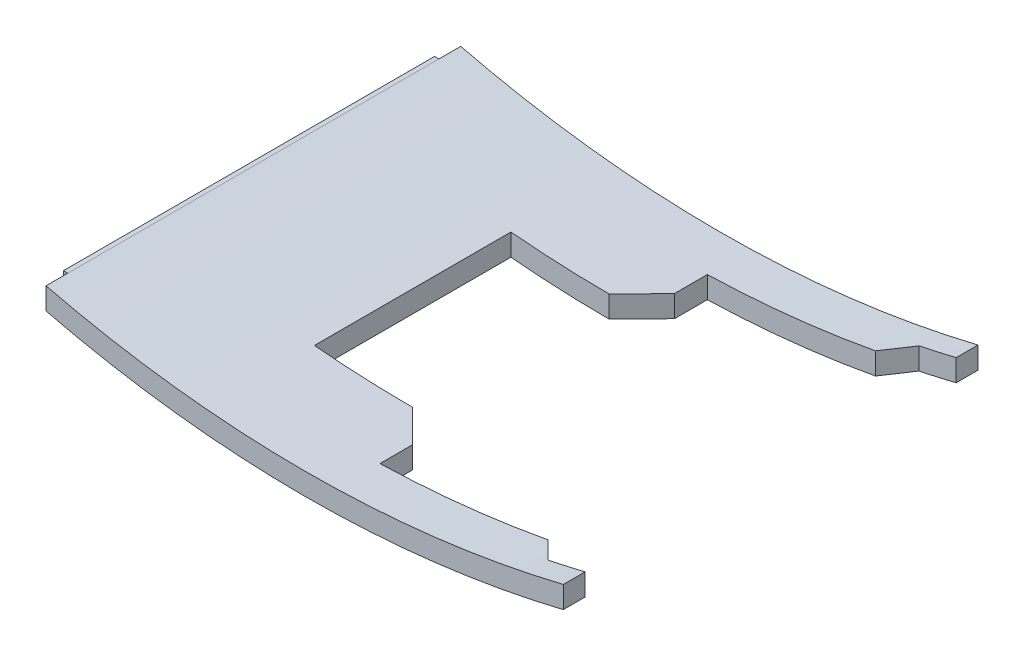
ISO-10303-21;
HEADER;
FILE_DESCRIPTION(('STEP AP214'),'2;1');
FILE_NAME('part.step','',(''),(''),'','','');
FILE_SCHEMA(('AUTOMOTIVE_DESIGN { 1 0 10303 214 1 1 1 1 }'));
ENDSEC;
DATA;
#1=APPLICATION_CONTEXT('core data for automotive mechanical design processes');
#2=APPLICATION_PROTOCOL_DEFINITION('international standard','automotive_design',2000,#1);
#3=PRODUCT_CONTEXT('',#1,'mechanical');
#4=PRODUCT('Part','Part','',(#3));
#5=PRODUCT_RELATED_PRODUCT_CATEGORY('part','',(#4));
#6=PRODUCT_DEFINITION_FORMATION('','',#4);
#7=PRODUCT_DEFINITION_CONTEXT('part definition',#1,'design');
#8=PRODUCT_DEFINITION('design','',#6,#7);
#9=PRODUCT_DEFINITION_SHAPE('','',#8);
#10=(LENGTH_UNIT() NAMED_UNIT(*) SI_UNIT(.MILLI.,.METRE.));
#11=(NAMED_UNIT(*) PLANE_ANGLE_UNIT() SI_UNIT($,.RADIAN.));
#12=(NAMED_UNIT(*) SI_UNIT($,.STERADIAN.) SOLID_ANGLE_UNIT());
#13=UNCERTAINTY_MEASURE_WITH_UNIT(LENGTH_MEASURE(1.E-05),#10,'distance_accuracy_value','');
#14=(GEOMETRIC_REPRESENTATION_CONTEXT(3) GLOBAL_UNCERTAINTY_ASSIGNED_CONTEXT((#13)) GLOBAL_UNIT_ASSIGNED_CONTEXT((#10,
#11,#12)) REPRESENTATION_CONTEXT('',''));
#15=CARTESIAN_POINT('',(0.,0.,0.));
#16=DIRECTION('',(0.,0.,1.));
#17=DIRECTION('',(1.,0.,0.));
#18=AXIS2_PLACEMENT_3D('',#15,#16,#17);
#19=CARTESIAN_POINT('',(0.,0.,48.26));
#20=DIRECTION('',(1.,0.,0.));
#21=DIRECTION('',(0.,0.,-1.));
#22=AXIS2_PLACEMENT_3D('',#19,#20,#21);
#23=PLANE('',#22);
#24=DIRECTION('',(0.,-1.,0.));
#25=VECTOR('',#24,1.);
#26=CARTESIAN_POINT('',(0.,2.54,2.54));
#27=LINE('',#26,#25);
#28=CARTESIAN_POINT('',(0.,2.54,2.54000000000001));
#29=VERTEX_POINT('',#28);
#30=CARTESIAN_POINT('',(0.,0.,2.54000000000001));
#31=VERTEX_POINT('',#30);
#32=EDGE_CURVE('E214',#29,#31,#27,.T.);
#33=ORIENTED_EDGE('',*,*,#32,.F.);
#34=DIRECTION('',(0.,0.,-1.));
#35=VECTOR('',#34,1.);
#36=CARTESIAN_POINT('',(0.,2.54,48.26));
#37=LINE('',#36,#35);
#38=CARTESIAN_POINT('',(0.,2.54,0.));
#39=VERTEX_POINT('',#38);
#40=EDGE_CURVE('E289',#29,#39,#37,.T.);
#41=ORIENTED_EDGE('',*,*,#40,.T.);
#42=DIRECTION('',(0.,-1.,0.));
#43=VECTOR('',#42,1.);
#44=CARTESIAN_POINT('',(0.,0.,0.));
#45=LINE('',#44,#43);
#46=CARTESIAN_POINT('',(0.,0.,0.));
#47=VERTEX_POINT('',#46);
#48=EDGE_CURVE('E269',#39,#47,#45,.T.);
#49=ORIENTED_EDGE('',*,*,#48,.T.);
#50=DIRECTION('',(0.,0.,-1.));
#51=VECTOR('',#50,1.);
#52=CARTESIAN_POINT('',(0.,0.,48.26));
#53=LINE('',#52,#51);
#54=EDGE_CURVE('E275',#31,#47,#53,.T.);
#55=ORIENTED_EDGE('',*,*,#54,.F.);
#56=EDGE_LOOP('',(#33,#41,#49,#55));
#57=FACE_BOUND('',#56,.T.);
#58=ADVANCED_FACE('F41',(#57),#23,.F.);
#59=DIRECTION('',(0.,1.,0.));
#60=VECTOR('',#59,1.);
#61=CARTESIAN_POINT('',(0.,2.54,45.72));
#62=LINE('',#61,#60);
#63=CARTESIAN_POINT('',(0.,0.,45.72));
#64=VERTEX_POINT('',#63);
#65=CARTESIAN_POINT('',(0.,2.54,45.72));
#66=VERTEX_POINT('',#65);
#67=EDGE_CURVE('E396',#64,#66,#62,.T.);
#68=ORIENTED_EDGE('',*,*,#67,.F.);
#69=CARTESIAN_POINT('',(0.,0.,48.26));
#70=VERTEX_POINT('',#69);
#71=EDGE_CURVE('E286',#70,#64,#53,.T.);
#72=ORIENTED_EDGE('',*,*,#71,.F.);
#73=DIRECTION('',(0.,-1.,0.));
#74=VECTOR('',#73,1.);
#75=CARTESIAN_POINT('',(0.,0.,48.26));
#76=LINE('',#75,#74);
#77=CARTESIAN_POINT('',(0.,2.54,48.26));
#78=VERTEX_POINT('',#77);
#79=EDGE_CURVE('E273',#78,#70,#76,.T.);
#80=ORIENTED_EDGE('',*,*,#79,.F.);
#81=EDGE_CURVE('E290',#78,#66,#37,.T.);
#82=ORIENTED_EDGE('',*,*,#81,.T.);
#83=EDGE_LOOP('',(#68,#72,#80,#82));
#84=FACE_BOUND('',#83,.T.);
#85=ADVANCED_FACE('F456',(#84),#23,.F.);
#86=CARTESIAN_POINT('',(60.198,0.,48.26));
#87=DIRECTION('',(-1.,0.,0.));
#88=DIRECTION('',(0.,0.,1.));
#89=AXIS2_PLACEMENT_3D('',#86,#87,#88);
#90=PLANE('',#89);
#91=DIRECTION('',(0.,0.,-1.));
#92=VECTOR('',#91,1.);
#93=CARTESIAN_POINT('',(60.198,0.,48.26));
#94=LINE('',#93,#92);
#95=CARTESIAN_POINT('',(60.198,0.,48.26));
#96=VERTEX_POINT('',#95);
#97=CARTESIAN_POINT('',(60.198,0.,45.72));
#98=VERTEX_POINT('',#97);
#99=EDGE_CURVE('E297',#96,#98,#94,.T.);
#100=ORIENTED_EDGE('',*,*,#99,.T.);
#101=DIRECTION('',(0.,1.,0.));
#102=VECTOR('',#101,1.);
#103=CARTESIAN_POINT('',(60.198,-21.59,45.72));
#104=LINE('',#103,#102);
#105=CARTESIAN_POINT('',(60.198,2.54000000000001,45.72));
#106=VERTEX_POINT('',#105);
#107=EDGE_CURVE('E215',#98,#106,#104,.T.);
#108=ORIENTED_EDGE('',*,*,#107,.T.);
#109=DIRECTION('',(0.,0.,-1.));
#110=VECTOR('',#109,1.);
#111=CARTESIAN_POINT('',(60.198,2.54,48.26));
#112=LINE('',#111,#110);
#113=CARTESIAN_POINT('',(60.198,2.54,48.26));
#114=VERTEX_POINT('',#113);
#115=EDGE_CURVE('E293',#114,#106,#112,.T.);
#116=ORIENTED_EDGE('',*,*,#115,.F.);
#117=DIRECTION('',(0.,1.,0.));
#118=VECTOR('',#117,1.);
#119=CARTESIAN_POINT('',(60.198,0.,48.26));
#120=LINE('',#119,#118);
#121=EDGE_CURVE('E268',#96,#114,#120,.T.);
#122=ORIENTED_EDGE('',*,*,#121,.F.);
#123=EDGE_LOOP('',(#100,#108,#116,#122));
#124=FACE_BOUND('',#123,.T.);
#125=ADVANCED_FACE('F386',(#124),#90,.F.);
#126=CARTESIAN_POINT('',(30.099,123.381725547181,48.26));
#127=DIRECTION('',(0.,0.,-1.));
#128=DIRECTION('',(-1.,0.,0.));
#129=AXIS2_PLACEMENT_3D('',#126,#127,#128);
#130=CYLINDRICAL_SURFACE('',#129,127.);
#131=DIRECTION('',(0.,0.,-1.));
#132=VECTOR('',#131,1.);
#133=CARTESIAN_POINT('',(33.782,-3.56485972000879,48.26));
#134=LINE('',#133,#132);
#135=CARTESIAN_POINT('',(33.782,-3.56485972000882,5.08));
#136=VERTEX_POINT('',#135);
#137=CARTESIAN_POINT('',(33.782,-3.56485972000879,8.89000000000001));
#138=VERTEX_POINT('',#137);
#139=EDGE_CURVE('E233',#136,#138,#134,.F.);
#140=ORIENTED_EDGE('',*,*,#139,.T.);
#141=CARTESIAN_POINT('',(30.099,123.381725547181,12.573));
#142=DIRECTION('',(-0.707106781186549,0.,-0.707106781186546));
#143=DIRECTION('',(0.707106781186546,0.,-0.707106781186549));
#144=AXIS2_PLACEMENT_3D('',#141,#142,#143);
#145=ELLIPSE('',#144,179.605122421383,127.);
#146=CARTESIAN_POINT('',(29.972,-3.61821095280269,12.7));
#147=VERTEX_POINT('',#146);
#148=EDGE_CURVE('E350',#138,#147,#145,.T.);
#149=ORIENTED_EDGE('',*,*,#148,.T.);
#150=CARTESIAN_POINT('',(30.099,123.381725547181,12.7));
#151=DIRECTION('',(0.,0.,-1.));
#152=DIRECTION('',(-1.,0.,0.));
#153=AXIS2_PLACEMENT_3D('',#150,#151,#152);
#154=CIRCLE('',#153,127.);
#155=CARTESIAN_POINT('',(18.542,-3.09133779438552,12.7));
#156=VERTEX_POINT('',#155);
#157=EDGE_CURVE('E255',#147,#156,#154,.T.);
#158=ORIENTED_EDGE('',*,*,#157,.T.);
#159=DIRECTION('',(0.,0.,-1.));
#160=VECTOR('',#159,1.);
#161=CARTESIAN_POINT('',(18.542,-3.09133779438549,48.26));
#162=LINE('',#161,#160);
#163=CARTESIAN_POINT('',(18.542,-3.09133779438549,35.56));
#164=VERTEX_POINT('',#163);
#165=EDGE_CURVE('E259',#156,#164,#162,.F.);
#166=ORIENTED_EDGE('',*,*,#165,.T.);
#167=CARTESIAN_POINT('',(30.099,123.381725547181,35.56));
#168=DIRECTION('',(0.,0.,1.));
#169=DIRECTION('',(1.,0.,0.));
#170=AXIS2_PLACEMENT_3D('',#167,#168,#169);
#171=CIRCLE('',#170,127.);
#172=CARTESIAN_POINT('',(29.972,-3.61821095280269,35.56));
#173=VERTEX_POINT('',#172);
#174=EDGE_CURVE('E262',#164,#173,#171,.T.);
#175=ORIENTED_EDGE('',*,*,#174,.T.);
#176=CARTESIAN_POINT('',(30.099,123.381725547181,35.687));
#177=DIRECTION('',(-0.707106781186547,0.,0.707106781186548));
#178=DIRECTION('',(-0.707106781186548,0.,-0.707106781186547));
#179=AXIS2_PLACEMENT_3D('',#176,#177,#178);
#180=ELLIPSE('',#179,179.605122421383,127.);
#181=CARTESIAN_POINT('',(33.782,-3.56485972000879,39.37));
#182=VERTEX_POINT('',#181);
#183=EDGE_CURVE('E57',#173,#182,#180,.T.);
#184=ORIENTED_EDGE('',*,*,#183,.T.);
#185=DIRECTION('',(0.,0.,-1.));
#186=VECTOR('',#185,1.);
#187=CARTESIAN_POINT('',(33.782,-3.56485972000879,48.26));
#188=LINE('',#187,#186);
#189=CARTESIAN_POINT('',(33.782,-3.56485972000882,43.18));
#190=VERTEX_POINT('',#189);
#191=EDGE_CURVE('E239',#182,#190,#188,.F.);
#192=ORIENTED_EDGE('',*,*,#191,.T.);
#193=CARTESIAN_POINT('',(30.099,123.381725547181,43.18));
#194=DIRECTION('',(0.,0.,1.));
#195=DIRECTION('',(1.,0.,0.));
#196=AXIS2_PLACEMENT_3D('',#193,#194,#195);
#197=CIRCLE('',#196,127.);
#198=CARTESIAN_POINT('',(53.34,-1.47361442272134,43.18));
#199=VERTEX_POINT('',#198);
#200=EDGE_CURVE('E241',#190,#199,#197,.T.);
#201=ORIENTED_EDGE('',*,*,#200,.T.);
#202=CARTESIAN_POINT('',(30.099,123.381725547181,19.9389999999998));
#203=DIRECTION('',(-0.707106781186551,0.,0.707106781186544));
#204=DIRECTION('',(-0.707106781186544,0.,-0.707106781186551));
#205=AXIS2_PLACEMENT_3D('',#202,#203,#204);
#206=ELLIPSE('',#205,179.605122421384,127.);
#207=CARTESIAN_POINT('',(55.88,-0.973974117128287,45.72));
#208=VERTEX_POINT('',#207);
#209=EDGE_CURVE('E328',#199,#208,#206,.T.);
#210=ORIENTED_EDGE('',*,*,#209,.T.);
#211=CARTESIAN_POINT('',(30.099,123.381725547181,45.72));
#212=DIRECTION('',(0.,0.,1.));
#213=DIRECTION('',(1.,0.,0.));
#214=AXIS2_PLACEMENT_3D('',#211,#212,#213);
#215=CIRCLE('',#214,127.);
#216=EDGE_CURVE('E244',#208,#98,#215,.T.);
#217=ORIENTED_EDGE('',*,*,#216,.T.);
#218=ORIENTED_EDGE('',*,*,#99,.F.);
#219=CARTESIAN_POINT('',(30.099,123.381725547181,48.26));
#220=DIRECTION('',(0.,0.,1.));
#221=DIRECTION('',(1.,0.,0.));
#222=AXIS2_PLACEMENT_3D('',#219,#220,#221);
#223=CIRCLE('',#222,127.);
#224=EDGE_CURVE('E265',#70,#96,#223,.T.);
#225=ORIENTED_EDGE('',*,*,#224,.F.);
#226=ORIENTED_EDGE('',*,*,#71,.T.);
#227=DIRECTION('',(0.,0.,1.));
#228=VECTOR('',#227,1.);
#229=CARTESIAN_POINT('',(0.,0.,2.54));
#230=LINE('',#229,#228);
#231=EDGE_CURVE('E394',#31,#64,#230,.T.);
#232=ORIENTED_EDGE('',*,*,#231,.F.);
#233=ORIENTED_EDGE('',*,*,#54,.T.);
#234=CARTESIAN_POINT('',(30.099,123.381725547181,0.));
#235=DIRECTION('',(0.,0.,1.));
#236=DIRECTION('',(1.,0.,0.));
#237=AXIS2_PLACEMENT_3D('',#234,#235,#236);
#238=CIRCLE('',#237,127.);
#239=CARTESIAN_POINT('',(60.198,0.,0.));
#240=VERTEX_POINT('',#239);
#241=EDGE_CURVE('E264',#47,#240,#238,.T.);
#242=ORIENTED_EDGE('',*,*,#241,.T.);
#243=CARTESIAN_POINT('',(60.198,0.,2.54));
#244=VERTEX_POINT('',#243);
#245=EDGE_CURVE('E296',#244,#240,#94,.T.);
#246=ORIENTED_EDGE('',*,*,#245,.F.);
#247=CARTESIAN_POINT('',(30.099,123.381725547181,2.54));
#248=DIRECTION('',(0.,0.,-1.));
#249=DIRECTION('',(-1.,0.,0.));
#250=AXIS2_PLACEMENT_3D('',#247,#248,#249);
#251=CIRCLE('',#250,127.);
#252=CARTESIAN_POINT('',(55.88,-0.973974117128297,2.54));
#253=VERTEX_POINT('',#252);
#254=EDGE_CURVE('E247',#244,#253,#251,.T.);
#255=ORIENTED_EDGE('',*,*,#254,.T.);
#256=CARTESIAN_POINT('',(30.099,123.381725547181,28.3209999999998));
#257=DIRECTION('',(-0.707106781186544,0.,-0.707106781186551));
#258=DIRECTION('',(0.707106781186551,0.,-0.707106781186544));
#259=AXIS2_PLACEMENT_3D('',#256,#257,#258);
#260=ELLIPSE('',#259,179.605122421382,127.);
#261=CARTESIAN_POINT('',(53.34,-1.47361442272136,5.08));
#262=VERTEX_POINT('',#261);
#263=EDGE_CURVE('E326',#253,#262,#260,.T.);
#264=ORIENTED_EDGE('',*,*,#263,.T.);
#265=CARTESIAN_POINT('',(30.099,123.381725547181,5.08));
#266=DIRECTION('',(0.,0.,-1.));
#267=DIRECTION('',(-1.,0.,0.));
#268=AXIS2_PLACEMENT_3D('',#265,#266,#267);
#269=CIRCLE('',#268,127.);
#270=EDGE_CURVE('E249',#262,#136,#269,.T.);
#271=ORIENTED_EDGE('',*,*,#270,.T.);
#272=EDGE_LOOP('',(#140,#149,#158,#166,#175,#184,#192,#201,#210,#217,#218,#225,#226,#232,#233,
#242,#246,#255,#264,#271));
#273=FACE_BOUND('',#272,.T.);
#274=ADVANCED_FACE('F356',(#273),#130,.T.);
#275=CARTESIAN_POINT('',(60.198,2.54000000000003,2.54));
#276=VERTEX_POINT('',#275);
#277=CARTESIAN_POINT('',(60.198,2.54,0.));
#278=VERTEX_POINT('',#277);
#279=EDGE_CURVE('E292',#276,#278,#112,.T.);
#280=ORIENTED_EDGE('',*,*,#279,.F.);
#281=DIRECTION('',(0.,1.,0.));
#282=VECTOR('',#281,1.);
#283=CARTESIAN_POINT('',(60.198,-21.59,2.54));
#284=LINE('',#283,#282);
#285=EDGE_CURVE('E228',#244,#276,#284,.T.);
#286=ORIENTED_EDGE('',*,*,#285,.F.);
#287=ORIENTED_EDGE('',*,*,#245,.T.);
#288=DIRECTION('',(0.,1.,0.));
#289=VECTOR('',#288,1.);
#290=CARTESIAN_POINT('',(60.198,0.,0.));
#291=LINE('',#290,#289);
#292=EDGE_CURVE('E278',#240,#278,#291,.T.);
#293=ORIENTED_EDGE('',*,*,#292,.T.);
#294=EDGE_LOOP('',(#280,#286,#287,#293));
#295=FACE_BOUND('',#294,.T.);
#296=ADVANCED_FACE('F426',(#295),#90,.F.);
#297=CARTESIAN_POINT('',(30.099,125.921725547181,48.26));
#298=DIRECTION('',(0.,0.,-1.));
#299=DIRECTION('',(-1.,0.,0.));
#300=AXIS2_PLACEMENT_3D('',#297,#298,#299);
#301=CYLINDRICAL_SURFACE('',#300,127.);
#302=CARTESIAN_POINT('',(30.099,125.921725547181,12.7));
#303=DIRECTION('',(0.,0.,-1.));
#304=DIRECTION('',(-1.,0.,0.));
#305=AXIS2_PLACEMENT_3D('',#302,#303,#304);
#306=CIRCLE('',#305,127.);
#307=CARTESIAN_POINT('',(18.542,-0.551337794385515,12.7));
#308=VERTEX_POINT('',#307);
#309=CARTESIAN_POINT('',(29.972,-1.07821095280269,12.7));
#310=VERTEX_POINT('',#309);
#311=EDGE_CURVE('E300',#308,#310,#306,.F.);
#312=ORIENTED_EDGE('',*,*,#311,.T.);
#313=CARTESIAN_POINT('',(30.099,125.921725547181,12.573));
#314=DIRECTION('',(-0.707106781186549,0.,-0.707106781186546));
#315=DIRECTION('',(0.707106781186546,0.,-0.707106781186549));
#316=AXIS2_PLACEMENT_3D('',#313,#314,#315);
#317=ELLIPSE('',#316,179.605122421383,127.);
#318=CARTESIAN_POINT('',(33.782,-1.02485972000879,8.89000000000001));
#319=VERTEX_POINT('',#318);
#320=EDGE_CURVE('E345',#310,#319,#317,.F.);
#321=ORIENTED_EDGE('',*,*,#320,.T.);
#322=DIRECTION('',(0.,0.,-1.));
#323=VECTOR('',#322,1.);
#324=CARTESIAN_POINT('',(33.782,-1.02485972000879,48.26));
#325=LINE('',#324,#323);
#326=CARTESIAN_POINT('',(33.782,-1.02485972000882,5.08));
#327=VERTEX_POINT('',#326);
#328=EDGE_CURVE('E227',#319,#327,#325,.T.);
#329=ORIENTED_EDGE('',*,*,#328,.T.);
#330=CARTESIAN_POINT('',(30.099,125.921725547181,5.08));
#331=DIRECTION('',(0.,0.,-1.));
#332=DIRECTION('',(-1.,0.,0.));
#333=AXIS2_PLACEMENT_3D('',#330,#331,#332);
#334=CIRCLE('',#333,127.);
#335=CARTESIAN_POINT('',(53.34,1.06638557727864,5.08));
#336=VERTEX_POINT('',#335);
#337=EDGE_CURVE('E315',#327,#336,#334,.F.);
#338=ORIENTED_EDGE('',*,*,#337,.T.);
#339=CARTESIAN_POINT('',(30.099,125.921725547181,28.3209999999998));
#340=DIRECTION('',(-0.707106781186544,0.,-0.707106781186551));
#341=DIRECTION('',(0.707106781186551,0.,-0.707106781186544));
#342=AXIS2_PLACEMENT_3D('',#339,#340,#341);
#343=ELLIPSE('',#342,179.605122421382,127.);
#344=CARTESIAN_POINT('',(55.88,1.5660258828717,2.54));
#345=VERTEX_POINT('',#344);
#346=EDGE_CURVE('E318',#336,#345,#343,.F.);
#347=ORIENTED_EDGE('',*,*,#346,.T.);
#348=CARTESIAN_POINT('',(30.099,125.921725547181,2.54));
#349=DIRECTION('',(0.,0.,-1.));
#350=DIRECTION('',(-1.,0.,0.));
#351=AXIS2_PLACEMENT_3D('',#348,#349,#350);
#352=CIRCLE('',#351,127.);
#353=EDGE_CURVE('E312',#345,#276,#352,.F.);
#354=ORIENTED_EDGE('',*,*,#353,.T.);
#355=ORIENTED_EDGE('',*,*,#279,.T.);
#356=CARTESIAN_POINT('',(30.099,125.921725547181,0.));
#357=DIRECTION('',(0.,0.,-1.));
#358=DIRECTION('',(1.,0.,0.));
#359=AXIS2_PLACEMENT_3D('',#356,#357,#358);
#360=CIRCLE('',#359,127.);
#361=EDGE_CURVE('E281',#278,#39,#360,.T.);
#362=ORIENTED_EDGE('',*,*,#361,.T.);
#363=ORIENTED_EDGE('',*,*,#40,.F.);
#364=DIRECTION('',(0.,0.,-1.));
#365=VECTOR('',#364,1.);
#366=CARTESIAN_POINT('',(0.,2.54,2.54));
#367=LINE('',#366,#365);
#368=EDGE_CURVE('E211',#66,#29,#367,.T.);
#369=ORIENTED_EDGE('',*,*,#368,.F.);
#370=ORIENTED_EDGE('',*,*,#81,.F.);
#371=CARTESIAN_POINT('',(30.099,125.921725547181,48.26));
#372=DIRECTION('',(0.,0.,-1.));
#373=DIRECTION('',(1.,0.,0.));
#374=AXIS2_PLACEMENT_3D('',#371,#372,#373);
#375=CIRCLE('',#374,127.);
#376=EDGE_CURVE('E271',#114,#78,#375,.T.);
#377=ORIENTED_EDGE('',*,*,#376,.F.);
#378=ORIENTED_EDGE('',*,*,#115,.T.);
#379=CARTESIAN_POINT('',(30.099,125.921725547181,45.72));
#380=DIRECTION('',(0.,0.,1.));
#381=DIRECTION('',(1.,0.,0.));
#382=AXIS2_PLACEMENT_3D('',#379,#380,#381);
#383=CIRCLE('',#382,127.);
#384=CARTESIAN_POINT('',(55.88,1.56602588287171,45.72));
#385=VERTEX_POINT('',#384);
#386=EDGE_CURVE('E310',#106,#385,#383,.F.);
#387=ORIENTED_EDGE('',*,*,#386,.T.);
#388=CARTESIAN_POINT('',(30.099,125.921725547181,19.9389999999998));
#389=DIRECTION('',(-0.707106781186551,0.,0.707106781186544));
#390=DIRECTION('',(-0.707106781186544,0.,-0.707106781186551));
#391=AXIS2_PLACEMENT_3D('',#388,#389,#390);
#392=ELLIPSE('',#391,179.605122421384,127.);
#393=CARTESIAN_POINT('',(53.34,1.06638557727866,43.18));
#394=VERTEX_POINT('',#393);
#395=EDGE_CURVE('E321',#385,#394,#392,.F.);
#396=ORIENTED_EDGE('',*,*,#395,.T.);
#397=CARTESIAN_POINT('',(30.099,125.921725547181,43.18));
#398=DIRECTION('',(0.,0.,1.));
#399=DIRECTION('',(1.,0.,0.));
#400=AXIS2_PLACEMENT_3D('',#397,#398,#399);
#401=CIRCLE('',#400,127.);
#402=CARTESIAN_POINT('',(33.782,-1.02485972000882,43.18));
#403=VERTEX_POINT('',#402);
#404=EDGE_CURVE('E308',#394,#403,#401,.F.);
#405=ORIENTED_EDGE('',*,*,#404,.T.);
#406=DIRECTION('',(0.,0.,-1.));
#407=VECTOR('',#406,1.);
#408=CARTESIAN_POINT('',(33.782,-1.02485972000879,48.26));
#409=LINE('',#408,#407);
#410=CARTESIAN_POINT('',(33.782,-1.02485972000879,39.37));
#411=VERTEX_POINT('',#410);
#412=EDGE_CURVE('E236',#403,#411,#409,.T.);
#413=ORIENTED_EDGE('',*,*,#412,.T.);
#414=CARTESIAN_POINT('',(30.099,125.921725547181,35.687));
#415=DIRECTION('',(-0.707106781186547,0.,0.707106781186548));
#416=DIRECTION('',(-0.707106781186548,0.,-0.707106781186547));
#417=AXIS2_PLACEMENT_3D('',#414,#415,#416);
#418=ELLIPSE('',#417,179.605122421383,127.);
#419=CARTESIAN_POINT('',(29.972,-1.07821095280269,35.56));
#420=VERTEX_POINT('',#419);
#421=EDGE_CURVE('E343',#411,#420,#418,.F.);
#422=ORIENTED_EDGE('',*,*,#421,.T.);
#423=CARTESIAN_POINT('',(30.099,125.921725547181,35.56));
#424=DIRECTION('',(0.,0.,1.));
#425=DIRECTION('',(1.,0.,0.));
#426=AXIS2_PLACEMENT_3D('',#423,#424,#425);
#427=CIRCLE('',#426,127.);
#428=CARTESIAN_POINT('',(18.542,-0.551337794385487,35.56));
#429=VERTEX_POINT('',#428);
#430=EDGE_CURVE('E306',#420,#429,#427,.F.);
#431=ORIENTED_EDGE('',*,*,#430,.T.);
#432=DIRECTION('',(0.,0.,-1.));
#433=VECTOR('',#432,1.);
#434=CARTESIAN_POINT('',(18.542,-0.551337794385487,48.26));
#435=LINE('',#434,#433);
#436=EDGE_CURVE('E303',#429,#308,#435,.T.);
#437=ORIENTED_EDGE('',*,*,#436,.T.);
#438=EDGE_LOOP('',(#312,#321,#329,#338,#347,#354,#355,#362,#363,#369,#370,#377,#378,#387,#396,
#405,#413,#422,#431,#437));
#439=FACE_BOUND('',#438,.T.);
#440=ADVANCED_FACE('F367',(#439),#301,.F.);
#441=CARTESIAN_POINT('',(30.099,123.381725547181,48.26));
#442=DIRECTION('',(0.,0.,1.));
#443=DIRECTION('',(1.,0.,0.));
#444=AXIS2_PLACEMENT_3D('',#441,#442,#443);
#445=PLANE('',#444);
#446=ORIENTED_EDGE('',*,*,#224,.T.);
#447=ORIENTED_EDGE('',*,*,#121,.T.);
#448=ORIENTED_EDGE('',*,*,#376,.T.);
#449=ORIENTED_EDGE('',*,*,#79,.T.);
#450=EDGE_LOOP('',(#446,#447,#448,#449));
#451=FACE_BOUND('',#450,.T.);
#452=ADVANCED_FACE('F390',(#451),#445,.T.);
#453=CARTESIAN_POINT('',(30.099,123.381725547181,0.));
#454=DIRECTION('',(0.,0.,1.));
#455=DIRECTION('',(1.,0.,0.));
#456=AXIS2_PLACEMENT_3D('',#453,#454,#455);
#457=PLANE('',#456);
#458=ORIENTED_EDGE('',*,*,#241,.F.);
#459=ORIENTED_EDGE('',*,*,#48,.F.);
#460=ORIENTED_EDGE('',*,*,#361,.F.);
#461=ORIENTED_EDGE('',*,*,#292,.F.);
#462=EDGE_LOOP('',(#458,#459,#460,#461));
#463=FACE_BOUND('',#462,.T.);
#464=ADVANCED_FACE('F423',(#463),#457,.F.);
#465=CARTESIAN_POINT('',(60.198,-21.59,35.56));
#466=DIRECTION('',(0.,0.,1.));
#467=DIRECTION('',(1.,0.,0.));
#468=AXIS2_PLACEMENT_3D('',#465,#466,#467);
#469=PLANE('',#468);
#470=ORIENTED_EDGE('',*,*,#430,.F.);
#471=DIRECTION('',(0.,-1.,0.));
#472=VECTOR('',#471,1.);
#473=CARTESIAN_POINT('',(29.972,-21.59,35.56));
#474=LINE('',#473,#472);
#475=EDGE_CURVE('E50',#420,#173,#474,.T.);
#476=ORIENTED_EDGE('',*,*,#475,.T.);
#477=ORIENTED_EDGE('',*,*,#174,.F.);
#478=DIRECTION('',(0.,1.,0.));
#479=VECTOR('',#478,1.);
#480=CARTESIAN_POINT('',(18.542,-21.59,35.56));
#481=LINE('',#480,#479);
#482=EDGE_CURVE('E252',#164,#429,#481,.T.);
#483=ORIENTED_EDGE('',*,*,#482,.T.);
#484=EDGE_LOOP('',(#470,#476,#477,#483));
#485=FACE_BOUND('',#484,.T.);
#486=ADVANCED_FACE('F353',(#485),#469,.F.);
#487=CARTESIAN_POINT('',(18.542,-21.59,35.56));
#488=DIRECTION('',(-1.,0.,0.));
#489=DIRECTION('',(0.,0.,1.));
#490=AXIS2_PLACEMENT_3D('',#487,#488,#489);
#491=PLANE('',#490);
#492=DIRECTION('',(0.,1.,0.));
#493=VECTOR('',#492,1.);
#494=CARTESIAN_POINT('',(18.542,-21.59,12.7));
#495=LINE('',#494,#493);
#496=EDGE_CURVE('E251',#156,#308,#495,.T.);
#497=ORIENTED_EDGE('',*,*,#496,.T.);
#498=ORIENTED_EDGE('',*,*,#436,.F.);
#499=ORIENTED_EDGE('',*,*,#482,.F.);
#500=ORIENTED_EDGE('',*,*,#165,.F.);
#501=EDGE_LOOP('',(#497,#498,#499,#500));
#502=FACE_BOUND('',#501,.T.);
#503=ADVANCED_FACE('F361',(#502),#491,.F.);
#504=CARTESIAN_POINT('',(60.198,-21.59,12.7));
#505=DIRECTION('',(0.,0.,-1.));
#506=DIRECTION('',(-1.,0.,0.));
#507=AXIS2_PLACEMENT_3D('',#504,#505,#506);
#508=PLANE('',#507);
#509=ORIENTED_EDGE('',*,*,#157,.F.);
#510=DIRECTION('',(0.,1.,0.));
#511=VECTOR('',#510,1.);
#512=CARTESIAN_POINT('',(29.972,-21.59,12.7));
#513=LINE('',#512,#511);
#514=EDGE_CURVE('E340',#147,#310,#513,.T.);
#515=ORIENTED_EDGE('',*,*,#514,.T.);
#516=ORIENTED_EDGE('',*,*,#311,.F.);
#517=ORIENTED_EDGE('',*,*,#496,.F.);
#518=EDGE_LOOP('',(#509,#515,#516,#517));
#519=FACE_BOUND('',#518,.T.);
#520=ADVANCED_FACE('F364',(#519),#508,.F.);
#521=CARTESIAN_POINT('',(33.782,-21.59,5.08));
#522=DIRECTION('',(0.,0.,-1.));
#523=DIRECTION('',(-1.,0.,0.));
#524=AXIS2_PLACEMENT_3D('',#521,#522,#523);
#525=PLANE('',#524);
#526=ORIENTED_EDGE('',*,*,#270,.F.);
#527=DIRECTION('',(0.,1.,0.));
#528=VECTOR('',#527,1.);
#529=CARTESIAN_POINT('',(53.34,-21.59,5.08));
#530=LINE('',#529,#528);
#531=EDGE_CURVE('E331',#262,#336,#530,.T.);
#532=ORIENTED_EDGE('',*,*,#531,.T.);
#533=ORIENTED_EDGE('',*,*,#337,.F.);
#534=DIRECTION('',(0.,1.,0.));
#535=VECTOR('',#534,1.);
#536=CARTESIAN_POINT('',(33.782,-21.59,5.08));
#537=LINE('',#536,#535);
#538=EDGE_CURVE('E224',#136,#327,#537,.T.);
#539=ORIENTED_EDGE('',*,*,#538,.F.);
#540=EDGE_LOOP('',(#526,#532,#533,#539));
#541=FACE_BOUND('',#540,.T.);
#542=ADVANCED_FACE('F440',(#541),#525,.F.);
#543=CARTESIAN_POINT('',(56.388,-21.59,2.54));
#544=DIRECTION('',(0.,0.,-1.));
#545=DIRECTION('',(-1.,0.,0.));
#546=AXIS2_PLACEMENT_3D('',#543,#544,#545);
#547=PLANE('',#546);
#548=ORIENTED_EDGE('',*,*,#285,.T.);
#549=ORIENTED_EDGE('',*,*,#353,.F.);
#550=DIRECTION('',(0.,1.,0.));
#551=VECTOR('',#550,1.);
#552=CARTESIAN_POINT('',(55.88,-21.59,2.54));
#553=LINE('',#552,#551);
#554=EDGE_CURVE('E337',#345,#253,#553,.F.);
#555=ORIENTED_EDGE('',*,*,#554,.T.);
#556=ORIENTED_EDGE('',*,*,#254,.F.);
#557=EDGE_LOOP('',(#548,#549,#555,#556));
#558=FACE_BOUND('',#557,.T.);
#559=ADVANCED_FACE('F429',(#558),#547,.F.);
#560=CARTESIAN_POINT('',(33.782,-21.59,12.7));
#561=DIRECTION('',(-1.,0.,0.));
#562=DIRECTION('',(0.,0.,1.));
#563=AXIS2_PLACEMENT_3D('',#560,#561,#562);
#564=PLANE('',#563);
#565=ORIENTED_EDGE('',*,*,#328,.F.);
#566=DIRECTION('',(0.,-1.,0.));
#567=VECTOR('',#566,1.);
#568=CARTESIAN_POINT('',(33.782,-21.59,8.88999999999999));
#569=LINE('',#568,#567);
#570=EDGE_CURVE('E347',#319,#138,#569,.T.);
#571=ORIENTED_EDGE('',*,*,#570,.T.);
#572=ORIENTED_EDGE('',*,*,#139,.F.);
#573=ORIENTED_EDGE('',*,*,#538,.T.);
#574=EDGE_LOOP('',(#565,#571,#572,#573));
#575=FACE_BOUND('',#574,.T.);
#576=ADVANCED_FACE('F442',(#575),#564,.F.);
#577=CARTESIAN_POINT('',(56.388,-21.59,45.72));
#578=DIRECTION('',(0.,0.,1.));
#579=DIRECTION('',(1.,0.,0.));
#580=AXIS2_PLACEMENT_3D('',#577,#578,#579);
#581=PLANE('',#580);
#582=ORIENTED_EDGE('',*,*,#216,.F.);
#583=DIRECTION('',(0.,-1.,0.));
#584=VECTOR('',#583,1.);
#585=CARTESIAN_POINT('',(55.88,-21.59,45.72));
#586=LINE('',#585,#584);
#587=EDGE_CURVE('E334',#208,#385,#586,.F.);
#588=ORIENTED_EDGE('',*,*,#587,.T.);
#589=ORIENTED_EDGE('',*,*,#386,.F.);
#590=ORIENTED_EDGE('',*,*,#107,.F.);
#591=EDGE_LOOP('',(#582,#588,#589,#590));
#592=FACE_BOUND('',#591,.T.);
#593=ADVANCED_FACE('F500',(#592),#581,.F.);
#594=CARTESIAN_POINT('',(33.782,-21.59,43.18));
#595=DIRECTION('',(0.,0.,1.));
#596=DIRECTION('',(1.,0.,0.));
#597=AXIS2_PLACEMENT_3D('',#594,#595,#596);
#598=PLANE('',#597);
#599=ORIENTED_EDGE('',*,*,#404,.F.);
#600=DIRECTION('',(0.,-1.,0.));
#601=VECTOR('',#600,1.);
#602=CARTESIAN_POINT('',(53.34,-21.59,43.18));
#603=LINE('',#602,#601);
#604=EDGE_CURVE('E323',#394,#199,#603,.T.);
#605=ORIENTED_EDGE('',*,*,#604,.T.);
#606=ORIENTED_EDGE('',*,*,#200,.F.);
#607=DIRECTION('',(0.,1.,0.));
#608=VECTOR('',#607,1.);
#609=CARTESIAN_POINT('',(33.782,-21.59,43.18));
#610=LINE('',#609,#608);
#611=EDGE_CURVE('E218',#190,#403,#610,.T.);
#612=ORIENTED_EDGE('',*,*,#611,.T.);
#613=EDGE_LOOP('',(#599,#605,#606,#612));
#614=FACE_BOUND('',#613,.T.);
#615=ADVANCED_FACE('F376',(#614),#598,.F.);
#616=CARTESIAN_POINT('',(33.782,-21.59,35.56));
#617=DIRECTION('',(-1.,0.,0.));
#618=DIRECTION('',(0.,0.,1.));
#619=AXIS2_PLACEMENT_3D('',#616,#617,#618);
#620=PLANE('',#619);
#621=ORIENTED_EDGE('',*,*,#191,.F.);
#622=DIRECTION('',(0.,1.,0.));
#623=VECTOR('',#622,1.);
#624=CARTESIAN_POINT('',(33.782,-21.59,39.37));
#625=LINE('',#624,#623);
#626=EDGE_CURVE('E11',#182,#411,#625,.T.);
#627=ORIENTED_EDGE('',*,*,#626,.T.);
#628=ORIENTED_EDGE('',*,*,#412,.F.);
#629=ORIENTED_EDGE('',*,*,#611,.F.);
#630=EDGE_LOOP('',(#621,#627,#628,#629));
#631=FACE_BOUND('',#630,.T.);
#632=ADVANCED_FACE('F371',(#631),#620,.F.);
#633=CARTESIAN_POINT('',(-0.508,2.54,2.54));
#634=DIRECTION('',(0.,0.,1.));
#635=DIRECTION('',(1.,0.,0.));
#636=AXIS2_PLACEMENT_3D('',#633,#634,#635);
#637=PLANE('',#636);
#638=ORIENTED_EDGE('',*,*,#32,.T.);
#639=DIRECTION('',(1.,0.,0.));
#640=VECTOR('',#639,1.);
#641=CARTESIAN_POINT('',(-0.508,0.,2.54));
#642=LINE('',#641,#640);
#643=CARTESIAN_POINT('',(-0.508,0.,2.54));
#644=VERTEX_POINT('',#643);
#645=EDGE_CURVE('E195',#644,#31,#642,.T.);
#646=ORIENTED_EDGE('',*,*,#645,.F.);
#647=DIRECTION('',(0.,-1.,0.));
#648=VECTOR('',#647,1.);
#649=CARTESIAN_POINT('',(-0.508,2.54,2.54));
#650=LINE('',#649,#648);
#651=CARTESIAN_POINT('',(-0.508,2.54,2.54));
#652=VERTEX_POINT('',#651);
#653=EDGE_CURVE('E202',#652,#644,#650,.T.);
#654=ORIENTED_EDGE('',*,*,#653,.F.);
#655=DIRECTION('',(1.,0.,0.));
#656=VECTOR('',#655,1.);
#657=CARTESIAN_POINT('',(-0.508,2.54,2.54));
#658=LINE('',#657,#656);
#659=EDGE_CURVE('E404',#652,#29,#658,.T.);
#660=ORIENTED_EDGE('',*,*,#659,.T.);
#661=EDGE_LOOP('',(#638,#646,#654,#660));
#662=FACE_BOUND('',#661,.T.);
#663=ADVANCED_FACE('F213',(#662),#637,.F.);
#664=CARTESIAN_POINT('',(-0.508,0.,2.54));
#665=DIRECTION('',(0.,1.,0.));
#666=DIRECTION('',(0.,0.,1.));
#667=AXIS2_PLACEMENT_3D('',#664,#665,#666);
#668=PLANE('',#667);
#669=ORIENTED_EDGE('',*,*,#231,.T.);
#670=DIRECTION('',(1.,0.,0.));
#671=VECTOR('',#670,1.);
#672=CARTESIAN_POINT('',(-0.508,0.,45.72));
#673=LINE('',#672,#671);
#674=CARTESIAN_POINT('',(-0.508,0.,45.72));
#675=VERTEX_POINT('',#674);
#676=EDGE_CURVE('E198',#675,#64,#673,.T.);
#677=ORIENTED_EDGE('',*,*,#676,.F.);
#678=DIRECTION('',(0.,0.,1.));
#679=VECTOR('',#678,1.);
#680=CARTESIAN_POINT('',(-0.508,0.,2.54));
#681=LINE('',#680,#679);
#682=EDGE_CURVE('E190',#644,#675,#681,.T.);
#683=ORIENTED_EDGE('',*,*,#682,.F.);
#684=ORIENTED_EDGE('',*,*,#645,.T.);
#685=EDGE_LOOP('',(#669,#677,#683,#684));
#686=FACE_BOUND('',#685,.T.);
#687=ADVANCED_FACE('F193',(#686),#668,.F.);
#688=CARTESIAN_POINT('',(-0.508,2.54,45.72));
#689=DIRECTION('',(0.,0.,-1.));
#690=DIRECTION('',(-1.,0.,0.));
#691=AXIS2_PLACEMENT_3D('',#688,#689,#690);
#692=PLANE('',#691);
#693=ORIENTED_EDGE('',*,*,#67,.T.);
#694=DIRECTION('',(1.,0.,0.));
#695=VECTOR('',#694,1.);
#696=CARTESIAN_POINT('',(-0.508,2.54,45.72));
#697=LINE('',#696,#695);
#698=CARTESIAN_POINT('',(-0.508,2.54,45.72));
#699=VERTEX_POINT('',#698);
#700=EDGE_CURVE('E220',#699,#66,#697,.T.);
#701=ORIENTED_EDGE('',*,*,#700,.F.);
#702=DIRECTION('',(0.,1.,0.));
#703=VECTOR('',#702,1.);
#704=CARTESIAN_POINT('',(-0.508,2.54,45.72));
#705=LINE('',#704,#703);
#706=EDGE_CURVE('E201',#675,#699,#705,.T.);
#707=ORIENTED_EDGE('',*,*,#706,.F.);
#708=ORIENTED_EDGE('',*,*,#676,.T.);
#709=EDGE_LOOP('',(#693,#701,#707,#708));
#710=FACE_BOUND('',#709,.T.);
#711=ADVANCED_FACE('F400',(#710),#692,.F.);
#712=CARTESIAN_POINT('',(-0.508,2.54,2.54));
#713=DIRECTION('',(0.,-1.,0.));
#714=DIRECTION('',(0.,0.,-1.));
#715=AXIS2_PLACEMENT_3D('',#712,#713,#714);
#716=PLANE('',#715);
#717=ORIENTED_EDGE('',*,*,#368,.T.);
#718=ORIENTED_EDGE('',*,*,#659,.F.);
#719=DIRECTION('',(0.,0.,-1.));
#720=VECTOR('',#719,1.);
#721=CARTESIAN_POINT('',(-0.508,2.54,2.54));
#722=LINE('',#721,#720);
#723=EDGE_CURVE('E207',#699,#652,#722,.T.);
#724=ORIENTED_EDGE('',*,*,#723,.F.);
#725=ORIENTED_EDGE('',*,*,#700,.T.);
#726=EDGE_LOOP('',(#717,#718,#724,#725));
#727=FACE_BOUND('',#726,.T.);
#728=ADVANCED_FACE('F412',(#727),#716,.F.);
#729=CARTESIAN_POINT('',(-0.508,0.,0.));
#730=DIRECTION('',(-1.,0.,0.));
#731=DIRECTION('',(0.,0.,1.));
#732=AXIS2_PLACEMENT_3D('',#729,#730,#731);
#733=PLANE('',#732);
#734=ORIENTED_EDGE('',*,*,#653,.T.);
#735=ORIENTED_EDGE('',*,*,#682,.T.);
#736=ORIENTED_EDGE('',*,*,#706,.T.);
#737=ORIENTED_EDGE('',*,*,#723,.T.);
#738=EDGE_LOOP('',(#734,#735,#736,#737));
#739=FACE_BOUND('',#738,.T.);
#740=ADVANCED_FACE('F205',(#739),#733,.T.);
#741=CARTESIAN_POINT('',(56.388,-21.59,46.228));
#742=DIRECTION('',(-0.707106781186551,0.,0.707106781186544));
#743=DIRECTION('',(0.,1.,0.));
#744=AXIS2_PLACEMENT_3D('',#741,#742,#743);
#745=PLANE('',#744);
#746=ORIENTED_EDGE('',*,*,#209,.F.);
#747=ORIENTED_EDGE('',*,*,#604,.F.);
#748=ORIENTED_EDGE('',*,*,#395,.F.);
#749=ORIENTED_EDGE('',*,*,#587,.F.);
#750=EDGE_LOOP('',(#746,#747,#748,#749));
#751=FACE_BOUND('',#750,.T.);
#752=ADVANCED_FACE('F380',(#751),#745,.F.);
#753=CARTESIAN_POINT('',(53.34,-21.59,5.08));
#754=DIRECTION('',(-0.707106781186544,0.,-0.707106781186551));
#755=DIRECTION('',(0.,1.,0.));
#756=AXIS2_PLACEMENT_3D('',#753,#754,#755);
#757=PLANE('',#756);
#758=ORIENTED_EDGE('',*,*,#263,.F.);
#759=ORIENTED_EDGE('',*,*,#554,.F.);
#760=ORIENTED_EDGE('',*,*,#346,.F.);
#761=ORIENTED_EDGE('',*,*,#531,.F.);
#762=EDGE_LOOP('',(#758,#759,#760,#761));
#763=FACE_BOUND('',#762,.T.);
#764=ADVANCED_FACE('F435',(#763),#757,.F.);
#765=CARTESIAN_POINT('',(29.972,-21.59,12.7));
#766=DIRECTION('',(-0.707106781186549,0.,-0.707106781186546));
#767=DIRECTION('',(0.,1.,0.));
#768=AXIS2_PLACEMENT_3D('',#765,#766,#767);
#769=PLANE('',#768);
#770=ORIENTED_EDGE('',*,*,#148,.F.);
#771=ORIENTED_EDGE('',*,*,#570,.F.);
#772=ORIENTED_EDGE('',*,*,#320,.F.);
#773=ORIENTED_EDGE('',*,*,#514,.F.);
#774=EDGE_LOOP('',(#770,#771,#772,#773));
#775=FACE_BOUND('',#774,.T.);
#776=ADVANCED_FACE('F446',(#775),#769,.F.);
#777=CARTESIAN_POINT('',(29.972,-21.59,35.56));
#778=DIRECTION('',(-0.707106781186547,0.,0.707106781186548));
#779=DIRECTION('',(0.,-1.,0.));
#780=AXIS2_PLACEMENT_3D('',#777,#778,#779);
#781=PLANE('',#780);
#782=ORIENTED_EDGE('',*,*,#421,.F.);
#783=ORIENTED_EDGE('',*,*,#626,.F.);
#784=ORIENTED_EDGE('',*,*,#183,.F.);
#785=ORIENTED_EDGE('',*,*,#475,.F.);
#786=EDGE_LOOP('',(#782,#783,#784,#785));
#787=FACE_BOUND('',#786,.T.);
#788=ADVANCED_FACE('F44',(#787),#781,.F.);
#789=CLOSED_SHELL('',(#58,#85,#125,#274,#296,#440,#452,#464,#486,#503,#520,#542,#559,#576,#593,
#615,#632,#663,#687,#711,#728,#740,#752,#764,#776,#788));
#790=MANIFOLD_SOLID_BREP('B2',#789);
#791=ADVANCED_BREP_SHAPE_REPRESENTATION('',(#18,#790),#14);
#792=SHAPE_DEFINITION_REPRESENTATION(#9,#791);
ENDSEC;
END-ISO-10303-21;
